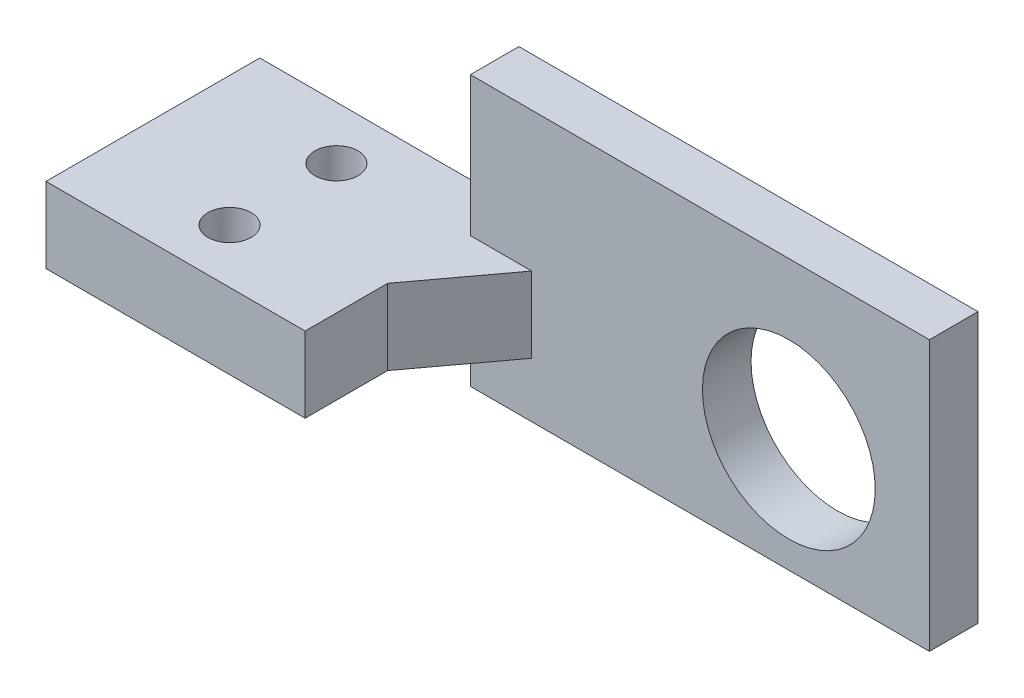
ISO-10303-21;
HEADER;
FILE_DESCRIPTION(('STEP AP214'),'2;1');
FILE_NAME('part.step','',(''),(''),'','','');
FILE_SCHEMA(('AUTOMOTIVE_DESIGN { 1 0 10303 214 1 1 1 1 }'));
ENDSEC;
DATA;
#1=APPLICATION_CONTEXT('core data for automotive mechanical design processes');
#2=APPLICATION_PROTOCOL_DEFINITION('international standard','automotive_design',2000,#1);
#3=PRODUCT_CONTEXT('',#1,'mechanical');
#4=PRODUCT('Part','Part','',(#3));
#5=PRODUCT_RELATED_PRODUCT_CATEGORY('part','',(#4));
#6=PRODUCT_DEFINITION_FORMATION('','',#4);
#7=PRODUCT_DEFINITION_CONTEXT('part definition',#1,'design');
#8=PRODUCT_DEFINITION('design','',#6,#7);
#9=PRODUCT_DEFINITION_SHAPE('','',#8);
#10=(LENGTH_UNIT() NAMED_UNIT(*) SI_UNIT(.MILLI.,.METRE.));
#11=(NAMED_UNIT(*) PLANE_ANGLE_UNIT() SI_UNIT($,.RADIAN.));
#12=(NAMED_UNIT(*) SI_UNIT($,.STERADIAN.) SOLID_ANGLE_UNIT());
#13=UNCERTAINTY_MEASURE_WITH_UNIT(LENGTH_MEASURE(1.E-05),#10,'distance_accuracy_value','');
#14=(GEOMETRIC_REPRESENTATION_CONTEXT(3) GLOBAL_UNCERTAINTY_ASSIGNED_CONTEXT((#13)) GLOBAL_UNIT_ASSIGNED_CONTEXT((#10,
#11,#12)) REPRESENTATION_CONTEXT('',''));
#15=CARTESIAN_POINT('',(0.,0.,0.));
#16=DIRECTION('',(0.,0.,1.));
#17=DIRECTION('',(1.,0.,0.));
#18=AXIS2_PLACEMENT_3D('',#15,#16,#17);
#19=CARTESIAN_POINT('',(0.,-75.,4.5));
#20=DIRECTION('',(0.,0.,-1.));
#21=DIRECTION('',(-1.,0.,0.));
#22=AXIS2_PLACEMENT_3D('',#19,#20,#21);
#23=PLANE('',#22);
#24=CARTESIAN_POINT('',(29.4984548601934,10.5,4.5));
#25=DIRECTION('',(0.,0.,1.));
#26=DIRECTION('',(1.,0.,0.));
#27=AXIS2_PLACEMENT_3D('',#24,#25,#26);
#28=CIRCLE('',#27,7.99999999999999);
#29=CARTESIAN_POINT('',(37.4984548601934,10.5,4.5));
#30=VERTEX_POINT('',#29);
#31=EDGE_CURVE('E149',#30,#30,#28,.T.);
#32=ORIENTED_EDGE('',*,*,#31,.F.);
#33=EDGE_LOOP('',(#32));
#34=FACE_BOUND('',#33,.T.);
#35=DIRECTION('',(0.,1.,0.));
#36=VECTOR('',#35,1.);
#37=CARTESIAN_POINT('',(0.,-75.,4.5));
#38=LINE('',#37,#36);
#39=CARTESIAN_POINT('',(0.,12.09,4.5));
#40=VERTEX_POINT('',#39);
#41=CARTESIAN_POINT('',(0.,25.,4.5));
#42=VERTEX_POINT('',#41);
#43=EDGE_CURVE('E212',#40,#42,#38,.T.);
#44=ORIENTED_EDGE('',*,*,#43,.F.);
#45=DIRECTION('',(1.,0.,0.));
#46=VECTOR('',#45,1.);
#47=CARTESIAN_POINT('',(5.68124358446198,12.09,4.5));
#48=LINE('',#47,#46);
#49=CARTESIAN_POINT('',(5.68124358446198,12.09,4.5));
#50=VERTEX_POINT('',#49);
#51=EDGE_CURVE('E51',#40,#50,#48,.T.);
#52=ORIENTED_EDGE('',*,*,#51,.T.);
#53=DIRECTION('',(0.,-1.,0.));
#54=VECTOR('',#53,1.);
#55=CARTESIAN_POINT('',(5.68124358446198,12.09,4.5));
#56=LINE('',#55,#54);
#57=CARTESIAN_POINT('',(5.68124358446198,5.09,4.5));
#58=VERTEX_POINT('',#57);
#59=EDGE_CURVE('E55',#50,#58,#56,.T.);
#60=ORIENTED_EDGE('',*,*,#59,.T.);
#61=DIRECTION('',(1.,0.,0.));
#62=VECTOR('',#61,1.);
#63=CARTESIAN_POINT('',(5.68124358446198,5.09,4.5));
#64=LINE('',#63,#62);
#65=CARTESIAN_POINT('',(0.,5.09,4.5));
#66=VERTEX_POINT('',#65);
#67=EDGE_CURVE('E155',#66,#58,#64,.T.);
#68=ORIENTED_EDGE('',*,*,#67,.F.);
#69=CARTESIAN_POINT('',(0.,0.,4.5));
#70=VERTEX_POINT('',#69);
#71=EDGE_CURVE('E214',#70,#66,#38,.T.);
#72=ORIENTED_EDGE('',*,*,#71,.F.);
#73=DIRECTION('',(-1.,0.,0.));
#74=VECTOR('',#73,1.);
#75=CARTESIAN_POINT('',(0.,0.,4.5));
#76=LINE('',#75,#74);
#77=CARTESIAN_POINT('',(42.5184548601934,0.,4.5));
#78=VERTEX_POINT('',#77);
#79=EDGE_CURVE('E130',#78,#70,#76,.T.);
#80=ORIENTED_EDGE('',*,*,#79,.F.);
#81=DIRECTION('',(0.,-1.,0.));
#82=VECTOR('',#81,1.);
#83=CARTESIAN_POINT('',(42.5184548601934,0.,4.5));
#84=LINE('',#83,#82);
#85=CARTESIAN_POINT('',(42.5184548601934,25.,4.5));
#86=VERTEX_POINT('',#85);
#87=EDGE_CURVE('E140',#86,#78,#84,.T.);
#88=ORIENTED_EDGE('',*,*,#87,.F.);
#89=DIRECTION('',(-1.,0.,0.));
#90=VECTOR('',#89,1.);
#91=CARTESIAN_POINT('',(0.,25.,4.5));
#92=LINE('',#91,#90);
#93=EDGE_CURVE('E136',#86,#42,#92,.T.);
#94=ORIENTED_EDGE('',*,*,#93,.T.);
#95=EDGE_LOOP('',(#44,#52,#60,#68,#72,#80,#88,#94));
#96=FACE_BOUND('',#95,.T.);
#97=ADVANCED_FACE('F34',(#34,#96),#23,.F.);
#98=CARTESIAN_POINT('',(0.,0.,4.8));
#99=DIRECTION('',(1.,0.,0.));
#100=DIRECTION('',(0.,1.,0.));
#101=AXIS2_PLACEMENT_3D('',#98,#99,#100);
#102=PLANE('',#101);
#103=DIRECTION('',(0.,0.,1.));
#104=VECTOR('',#103,1.);
#105=CARTESIAN_POINT('',(0.,5.09,0.));
#106=LINE('',#105,#104);
#107=CARTESIAN_POINT('',(0.,5.09,0.));
#108=VERTEX_POINT('',#107);
#109=EDGE_CURVE('E194',#108,#66,#106,.T.);
#110=ORIENTED_EDGE('',*,*,#109,.F.);
#111=DIRECTION('',(0.,-1.,0.));
#112=VECTOR('',#111,1.);
#113=CARTESIAN_POINT('',(0.,0.,0.));
#114=LINE('',#113,#112);
#115=CARTESIAN_POINT('',(0.,0.,0.));
#116=VERTEX_POINT('',#115);
#117=EDGE_CURVE('E129',#108,#116,#114,.T.);
#118=ORIENTED_EDGE('',*,*,#117,.T.);
#119=DIRECTION('',(0.,0.,-1.));
#120=VECTOR('',#119,1.);
#121=CARTESIAN_POINT('',(0.,0.,4.8));
#122=LINE('',#121,#120);
#123=EDGE_CURVE('E11',#70,#116,#122,.T.);
#124=ORIENTED_EDGE('',*,*,#123,.F.);
#125=ORIENTED_EDGE('',*,*,#71,.T.);
#126=EDGE_LOOP('',(#110,#118,#124,#125));
#127=FACE_BOUND('',#126,.T.);
#128=ADVANCED_FACE('F36',(#127),#102,.F.);
#129=DIRECTION('',(0.,0.,-1.));
#130=VECTOR('',#129,1.);
#131=CARTESIAN_POINT('',(0.,12.09,0.));
#132=LINE('',#131,#130);
#133=CARTESIAN_POINT('',(0.,12.09,0.));
#134=VERTEX_POINT('',#133);
#135=EDGE_CURVE('E199',#40,#134,#132,.T.);
#136=ORIENTED_EDGE('',*,*,#135,.F.);
#137=ORIENTED_EDGE('',*,*,#43,.T.);
#138=DIRECTION('',(0.,0.,-1.));
#139=VECTOR('',#138,1.);
#140=CARTESIAN_POINT('',(0.,25.,39.));
#141=LINE('',#140,#139);
#142=CARTESIAN_POINT('',(0.,25.,0.));
#143=VERTEX_POINT('',#142);
#144=EDGE_CURVE('E168',#42,#143,#141,.T.);
#145=ORIENTED_EDGE('',*,*,#144,.T.);
#146=EDGE_CURVE('E125',#143,#134,#114,.T.);
#147=ORIENTED_EDGE('',*,*,#146,.T.);
#148=EDGE_LOOP('',(#136,#137,#145,#147));
#149=FACE_BOUND('',#148,.T.);
#150=ADVANCED_FACE('F249',(#149),#102,.F.);
#151=CARTESIAN_POINT('',(0.,0.,4.8));
#152=DIRECTION('',(0.,1.,0.));
#153=DIRECTION('',(-1.,0.,0.));
#154=AXIS2_PLACEMENT_3D('',#151,#152,#153);
#155=PLANE('',#154);
#156=DIRECTION('',(1.,0.,0.));
#157=VECTOR('',#156,1.);
#158=CARTESIAN_POINT('',(0.,0.,0.));
#159=LINE('',#158,#157);
#160=CARTESIAN_POINT('',(42.5184548601934,0.,0.));
#161=VERTEX_POINT('',#160);
#162=EDGE_CURVE('E43',#116,#161,#159,.T.);
#163=ORIENTED_EDGE('',*,*,#162,.T.);
#164=DIRECTION('',(0.,0.,-1.));
#165=VECTOR('',#164,1.);
#166=CARTESIAN_POINT('',(42.5184548601934,0.,0.));
#167=LINE('',#166,#165);
#168=EDGE_CURVE('E145',#78,#161,#167,.T.);
#169=ORIENTED_EDGE('',*,*,#168,.F.);
#170=ORIENTED_EDGE('',*,*,#79,.T.);
#171=ORIENTED_EDGE('',*,*,#123,.T.);
#172=EDGE_LOOP('',(#163,#169,#170,#171));
#173=FACE_BOUND('',#172,.T.);
#174=ADVANCED_FACE('F256',(#173),#155,.F.);
#175=CARTESIAN_POINT('',(0.,0.,0.));
#176=DIRECTION('',(0.,0.,1.));
#177=DIRECTION('',(1.,0.,0.));
#178=AXIS2_PLACEMENT_3D('',#175,#176,#177);
#179=PLANE('',#178);
#180=CARTESIAN_POINT('',(29.4984548601934,10.5,0.));
#181=DIRECTION('',(0.,0.,1.));
#182=DIRECTION('',(1.,0.,0.));
#183=AXIS2_PLACEMENT_3D('',#180,#181,#182);
#184=CIRCLE('',#183,7.99999999999999);
#185=CARTESIAN_POINT('',(37.4984548601934,10.5,0.));
#186=VERTEX_POINT('',#185);
#187=EDGE_CURVE('E146',#186,#186,#184,.T.);
#188=ORIENTED_EDGE('',*,*,#187,.T.);
#189=EDGE_LOOP('',(#188));
#190=FACE_BOUND('',#189,.T.);
#191=ORIENTED_EDGE('',*,*,#146,.F.);
#192=DIRECTION('',(1.,0.,0.));
#193=VECTOR('',#192,1.);
#194=CARTESIAN_POINT('',(0.,25.,0.));
#195=LINE('',#194,#193);
#196=CARTESIAN_POINT('',(42.5184548601934,25.,0.));
#197=VERTEX_POINT('',#196);
#198=EDGE_CURVE('E118',#143,#197,#195,.T.);
#199=ORIENTED_EDGE('',*,*,#198,.T.);
#200=DIRECTION('',(0.,1.,0.));
#201=VECTOR('',#200,1.);
#202=CARTESIAN_POINT('',(42.5184548601934,0.,0.));
#203=LINE('',#202,#201);
#204=EDGE_CURVE('E123',#161,#197,#203,.T.);
#205=ORIENTED_EDGE('',*,*,#204,.F.);
#206=ORIENTED_EDGE('',*,*,#162,.F.);
#207=ORIENTED_EDGE('',*,*,#117,.F.);
#208=DIRECTION('',(1.,0.,0.));
#209=VECTOR('',#208,1.);
#210=CARTESIAN_POINT('',(-23.9999999999999,5.09,0.));
#211=LINE('',#210,#209);
#212=CARTESIAN_POINT('',(-23.9999999999999,5.09,0.));
#213=VERTEX_POINT('',#212);
#214=EDGE_CURVE('E208',#213,#108,#211,.T.);
#215=ORIENTED_EDGE('',*,*,#214,.F.);
#216=DIRECTION('',(0.,-1.,0.));
#217=VECTOR('',#216,1.);
#218=CARTESIAN_POINT('',(-23.9999999999999,12.09,0.));
#219=LINE('',#218,#217);
#220=CARTESIAN_POINT('',(-23.9999999999999,12.09,0.));
#221=VERTEX_POINT('',#220);
#222=EDGE_CURVE('E195',#221,#213,#219,.T.);
#223=ORIENTED_EDGE('',*,*,#222,.F.);
#224=DIRECTION('',(1.,0.,0.));
#225=VECTOR('',#224,1.);
#226=CARTESIAN_POINT('',(-23.9999999999999,12.09,0.));
#227=LINE('',#226,#225);
#228=EDGE_CURVE('E203',#221,#134,#227,.T.);
#229=ORIENTED_EDGE('',*,*,#228,.T.);
#230=EDGE_LOOP('',(#191,#199,#205,#206,#207,#215,#223,#229));
#231=FACE_BOUND('',#230,.T.);
#232=ADVANCED_FACE('F120',(#190,#231),#179,.F.);
#233=CARTESIAN_POINT('',(-24.,25.,-90.2));
#234=DIRECTION('',(0.,-1.,0.));
#235=DIRECTION('',(0.,0.,-1.));
#236=AXIS2_PLACEMENT_3D('',#233,#234,#235);
#237=PLANE('',#236);
#238=ORIENTED_EDGE('',*,*,#198,.F.);
#239=ORIENTED_EDGE('',*,*,#144,.F.);
#240=ORIENTED_EDGE('',*,*,#93,.F.);
#241=DIRECTION('',(0.,0.,1.));
#242=VECTOR('',#241,1.);
#243=CARTESIAN_POINT('',(42.5184548601934,25.,0.));
#244=LINE('',#243,#242);
#245=EDGE_CURVE('E133',#197,#86,#244,.T.);
#246=ORIENTED_EDGE('',*,*,#245,.F.);
#247=EDGE_LOOP('',(#238,#239,#240,#246));
#248=FACE_BOUND('',#247,.T.);
#249=ADVANCED_FACE('F134',(#248),#237,.F.);
#250=CARTESIAN_POINT('',(-23.9999999999999,5.09,0.));
#251=DIRECTION('',(0.,1.,0.));
#252=DIRECTION('',(-1.,0.,0.));
#253=AXIS2_PLACEMENT_3D('',#250,#251,#252);
#254=PLANE('',#253);
#255=CARTESIAN_POINT('',(-12.,5.09,4.9));
#256=DIRECTION('',(0.,1.,0.));
#257=DIRECTION('',(-1.,0.,0.));
#258=AXIS2_PLACEMENT_3D('',#255,#256,#257);
#259=CIRCLE('',#258,2.);
#260=CARTESIAN_POINT('',(-14.,5.09,4.9));
#261=VERTEX_POINT('',#260);
#262=EDGE_CURVE('E175',#261,#261,#259,.T.);
#263=ORIENTED_EDGE('',*,*,#262,.T.);
#264=EDGE_LOOP('',(#263));
#265=FACE_BOUND('',#264,.T.);
#266=CARTESIAN_POINT('',(-12.,5.09,14.8));
#267=DIRECTION('',(0.,1.,0.));
#268=DIRECTION('',(-1.,0.,0.));
#269=AXIS2_PLACEMENT_3D('',#266,#267,#268);
#270=CIRCLE('',#269,2.);
#271=CARTESIAN_POINT('',(-14.,5.09,14.8));
#272=VERTEX_POINT('',#271);
#273=EDGE_CURVE('E172',#272,#272,#270,.T.);
#274=ORIENTED_EDGE('',*,*,#273,.T.);
#275=EDGE_LOOP('',(#274));
#276=FACE_BOUND('',#275,.T.);
#277=ORIENTED_EDGE('',*,*,#109,.T.);
#278=ORIENTED_EDGE('',*,*,#67,.T.);
#279=DIRECTION('',(-0.596214877411112,0.,0.80282489993376));
#280=VECTOR('',#279,1.);
#281=CARTESIAN_POINT('',(0.,5.09,12.15));
#282=LINE('',#281,#280);
#283=CARTESIAN_POINT('',(0.,5.09,12.15));
#284=VERTEX_POINT('',#283);
#285=EDGE_CURVE('E158',#58,#284,#282,.T.);
#286=ORIENTED_EDGE('',*,*,#285,.T.);
#287=DIRECTION('',(0.,0.,-1.));
#288=VECTOR('',#287,1.);
#289=CARTESIAN_POINT('',(0.,5.09,19.8));
#290=LINE('',#289,#288);
#291=CARTESIAN_POINT('',(0.,5.09,19.8));
#292=VERTEX_POINT('',#291);
#293=EDGE_CURVE('E189',#292,#284,#290,.T.);
#294=ORIENTED_EDGE('',*,*,#293,.F.);
#295=DIRECTION('',(1.,0.,0.));
#296=VECTOR('',#295,1.);
#297=CARTESIAN_POINT('',(0.,5.09,19.8));
#298=LINE('',#297,#296);
#299=CARTESIAN_POINT('',(-23.9999999999999,5.08999999999999,19.8));
#300=VERTEX_POINT('',#299);
#301=EDGE_CURVE('E187',#300,#292,#298,.T.);
#302=ORIENTED_EDGE('',*,*,#301,.F.);
#303=DIRECTION('',(0.,0.,1.));
#304=VECTOR('',#303,1.);
#305=CARTESIAN_POINT('',(-23.9999999999999,5.09,0.));
#306=LINE('',#305,#304);
#307=EDGE_CURVE('E198',#213,#300,#306,.T.);
#308=ORIENTED_EDGE('',*,*,#307,.F.);
#309=ORIENTED_EDGE('',*,*,#214,.T.);
#310=EDGE_LOOP('',(#277,#278,#286,#294,#302,#308,#309));
#311=FACE_BOUND('',#310,.T.);
#312=ADVANCED_FACE('F232',(#265,#276,#311),#254,.F.);
#313=CARTESIAN_POINT('',(-23.9999999999999,12.09,0.));
#314=DIRECTION('',(0.,-1.,0.));
#315=DIRECTION('',(1.,0.,0.));
#316=AXIS2_PLACEMENT_3D('',#313,#314,#315);
#317=PLANE('',#316);
#318=CARTESIAN_POINT('',(-12.,12.09,4.9));
#319=DIRECTION('',(0.,-1.,0.));
#320=DIRECTION('',(1.,0.,0.));
#321=AXIS2_PLACEMENT_3D('',#318,#319,#320);
#322=CIRCLE('',#321,2.);
#323=CARTESIAN_POINT('',(-9.99999999999996,12.09,4.9));
#324=VERTEX_POINT('',#323);
#325=EDGE_CURVE('E38',#324,#324,#322,.T.);
#326=ORIENTED_EDGE('',*,*,#325,.T.);
#327=EDGE_LOOP('',(#326));
#328=FACE_BOUND('',#327,.T.);
#329=CARTESIAN_POINT('',(-12.,12.09,14.8));
#330=DIRECTION('',(0.,-1.,0.));
#331=DIRECTION('',(1.,0.,0.));
#332=AXIS2_PLACEMENT_3D('',#329,#330,#331);
#333=CIRCLE('',#332,2.);
#334=CARTESIAN_POINT('',(-9.99999999999996,12.09,14.8));
#335=VERTEX_POINT('',#334);
#336=EDGE_CURVE('E171',#335,#335,#333,.T.);
#337=ORIENTED_EDGE('',*,*,#336,.T.);
#338=EDGE_LOOP('',(#337));
#339=FACE_BOUND('',#338,.T.);
#340=ORIENTED_EDGE('',*,*,#135,.T.);
#341=ORIENTED_EDGE('',*,*,#228,.F.);
#342=DIRECTION('',(0.,0.,-1.));
#343=VECTOR('',#342,1.);
#344=CARTESIAN_POINT('',(-23.9999999999999,12.09,0.));
#345=LINE('',#344,#343);
#346=CARTESIAN_POINT('',(-23.9999999999999,12.09,19.8));
#347=VERTEX_POINT('',#346);
#348=EDGE_CURVE('E201',#347,#221,#345,.T.);
#349=ORIENTED_EDGE('',*,*,#348,.F.);
#350=DIRECTION('',(-1.,0.,0.));
#351=VECTOR('',#350,1.);
#352=CARTESIAN_POINT('',(0.,12.09,19.8));
#353=LINE('',#352,#351);
#354=CARTESIAN_POINT('',(0.,12.09,19.8));
#355=VERTEX_POINT('',#354);
#356=EDGE_CURVE('E181',#355,#347,#353,.T.);
#357=ORIENTED_EDGE('',*,*,#356,.F.);
#358=DIRECTION('',(0.,0.,-1.));
#359=VECTOR('',#358,1.);
#360=CARTESIAN_POINT('',(0.,12.09,19.8));
#361=LINE('',#360,#359);
#362=CARTESIAN_POINT('',(0.,12.09,12.15));
#363=VERTEX_POINT('',#362);
#364=EDGE_CURVE('E191',#355,#363,#361,.T.);
#365=ORIENTED_EDGE('',*,*,#364,.T.);
#366=DIRECTION('',(-0.596214877411112,0.,0.80282489993376));
#367=VECTOR('',#366,1.);
#368=CARTESIAN_POINT('',(0.,12.09,12.15));
#369=LINE('',#368,#367);
#370=EDGE_CURVE('E157',#50,#363,#369,.T.);
#371=ORIENTED_EDGE('',*,*,#370,.F.);
#372=ORIENTED_EDGE('',*,*,#51,.F.);
#373=EDGE_LOOP('',(#340,#341,#349,#357,#365,#371,#372));
#374=FACE_BOUND('',#373,.T.);
#375=ADVANCED_FACE('F221',(#328,#339,#374),#317,.F.);
#376=CARTESIAN_POINT('',(-23.9999999999999,0.,0.));
#377=DIRECTION('',(-1.,0.,0.));
#378=DIRECTION('',(0.,-1.,0.));
#379=AXIS2_PLACEMENT_3D('',#376,#377,#378);
#380=PLANE('',#379);
#381=ORIENTED_EDGE('',*,*,#222,.T.);
#382=ORIENTED_EDGE('',*,*,#307,.T.);
#383=DIRECTION('',(0.,-1.,0.));
#384=VECTOR('',#383,1.);
#385=CARTESIAN_POINT('',(-23.9999999999999,5.08999999999999,19.8));
#386=LINE('',#385,#384);
#387=EDGE_CURVE('E184',#347,#300,#386,.T.);
#388=ORIENTED_EDGE('',*,*,#387,.F.);
#389=ORIENTED_EDGE('',*,*,#348,.T.);
#390=EDGE_LOOP('',(#381,#382,#388,#389));
#391=FACE_BOUND('',#390,.T.);
#392=ADVANCED_FACE('F267',(#391),#380,.T.);
#393=CARTESIAN_POINT('',(0.,5.09,19.8));
#394=DIRECTION('',(-1.,0.,0.));
#395=DIRECTION('',(0.,0.,1.));
#396=AXIS2_PLACEMENT_3D('',#393,#394,#395);
#397=PLANE('',#396);
#398=ORIENTED_EDGE('',*,*,#293,.T.);
#399=DIRECTION('',(0.,-1.,0.));
#400=VECTOR('',#399,1.);
#401=CARTESIAN_POINT('',(0.,12.09,12.15));
#402=LINE('',#401,#400);
#403=EDGE_CURVE('E165',#363,#284,#402,.T.);
#404=ORIENTED_EDGE('',*,*,#403,.F.);
#405=ORIENTED_EDGE('',*,*,#364,.F.);
#406=DIRECTION('',(0.,1.,0.));
#407=VECTOR('',#406,1.);
#408=CARTESIAN_POINT('',(0.,5.09,19.8));
#409=LINE('',#408,#407);
#410=EDGE_CURVE('E178',#292,#355,#409,.T.);
#411=ORIENTED_EDGE('',*,*,#410,.F.);
#412=EDGE_LOOP('',(#398,#404,#405,#411));
#413=FACE_BOUND('',#412,.T.);
#414=ADVANCED_FACE('F277',(#413),#397,.F.);
#415=CARTESIAN_POINT('',(0.,0.,19.8));
#416=DIRECTION('',(0.,0.,1.));
#417=DIRECTION('',(1.,0.,0.));
#418=AXIS2_PLACEMENT_3D('',#415,#416,#417);
#419=PLANE('',#418);
#420=ORIENTED_EDGE('',*,*,#410,.T.);
#421=ORIENTED_EDGE('',*,*,#356,.T.);
#422=ORIENTED_EDGE('',*,*,#387,.T.);
#423=ORIENTED_EDGE('',*,*,#301,.T.);
#424=EDGE_LOOP('',(#420,#421,#422,#423));
#425=FACE_BOUND('',#424,.T.);
#426=ADVANCED_FACE('F228',(#425),#419,.T.);
#427=CARTESIAN_POINT('',(-12.,-14.,14.8));
#428=DIRECTION('',(0.,1.,0.));
#429=DIRECTION('',(0.,0.,1.));
#430=AXIS2_PLACEMENT_3D('',#427,#428,#429);
#431=CYLINDRICAL_SURFACE('',#430,2.);
#432=ORIENTED_EDGE('',*,*,#336,.F.);
#433=EDGE_LOOP('',(#432));
#434=FACE_BOUND('',#433,.T.);
#435=ORIENTED_EDGE('',*,*,#273,.F.);
#436=EDGE_LOOP('',(#435));
#437=FACE_BOUND('',#436,.T.);
#438=ADVANCED_FACE('F224',(#434,#437),#431,.F.);
#439=CARTESIAN_POINT('',(-12.,-14.,4.9));
#440=DIRECTION('',(0.,1.,0.));
#441=DIRECTION('',(0.,0.,1.));
#442=AXIS2_PLACEMENT_3D('',#439,#440,#441);
#443=CYLINDRICAL_SURFACE('',#442,2.);
#444=ORIENTED_EDGE('',*,*,#325,.F.);
#445=EDGE_LOOP('',(#444));
#446=FACE_BOUND('',#445,.T.);
#447=ORIENTED_EDGE('',*,*,#262,.F.);
#448=EDGE_LOOP('',(#447));
#449=FACE_BOUND('',#448,.T.);
#450=ADVANCED_FACE('F227',(#446,#449),#443,.F.);
#451=CARTESIAN_POINT('',(0.,12.09,12.15));
#452=DIRECTION('',(0.80282489993376,0.,0.596214877411112));
#453=DIRECTION('',(0.596214877411112,0.,-0.80282489993376));
#454=AXIS2_PLACEMENT_3D('',#451,#452,#453);
#455=PLANE('',#454);
#456=ORIENTED_EDGE('',*,*,#285,.F.);
#457=ORIENTED_EDGE('',*,*,#59,.F.);
#458=ORIENTED_EDGE('',*,*,#370,.T.);
#459=ORIENTED_EDGE('',*,*,#403,.T.);
#460=EDGE_LOOP('',(#456,#457,#458,#459));
#461=FACE_BOUND('',#460,.T.);
#462=ADVANCED_FACE('F272',(#461),#455,.T.);
#463=CARTESIAN_POINT('',(42.5184548601934,0.,0.));
#464=DIRECTION('',(1.,0.,0.));
#465=DIRECTION('',(0.,0.,-1.));
#466=AXIS2_PLACEMENT_3D('',#463,#464,#465);
#467=PLANE('',#466);
#468=ORIENTED_EDGE('',*,*,#204,.T.);
#469=ORIENTED_EDGE('',*,*,#245,.T.);
#470=ORIENTED_EDGE('',*,*,#87,.T.);
#471=ORIENTED_EDGE('',*,*,#168,.T.);
#472=EDGE_LOOP('',(#468,#469,#470,#471));
#473=FACE_BOUND('',#472,.T.);
#474=ADVANCED_FACE('F143',(#473),#467,.T.);
#475=CARTESIAN_POINT('',(29.4984548601934,10.5,0.));
#476=DIRECTION('',(0.,0.,1.));
#477=DIRECTION('',(1.,0.,0.));
#478=AXIS2_PLACEMENT_3D('',#475,#476,#477);
#479=CYLINDRICAL_SURFACE('',#478,7.99999999999999);
#480=ORIENTED_EDGE('',*,*,#187,.F.);
#481=EDGE_LOOP('',(#480));
#482=FACE_BOUND('',#481,.T.);
#483=ORIENTED_EDGE('',*,*,#31,.T.);
#484=EDGE_LOOP('',(#483));
#485=FACE_BOUND('',#484,.T.);
#486=ADVANCED_FACE('F305',(#482,#485),#479,.F.);
#487=CLOSED_SHELL('',(#97,#128,#150,#174,#232,#249,#312,#375,#392,#414,#426,#438,#450,#462,#474,#486));
#488=MANIFOLD_SOLID_BREP('B2',#487);
#489=ADVANCED_BREP_SHAPE_REPRESENTATION('',(#18,#488),#14);
#490=SHAPE_DEFINITION_REPRESENTATION(#9,#489);
ENDSEC;
END-ISO-10303-21;
